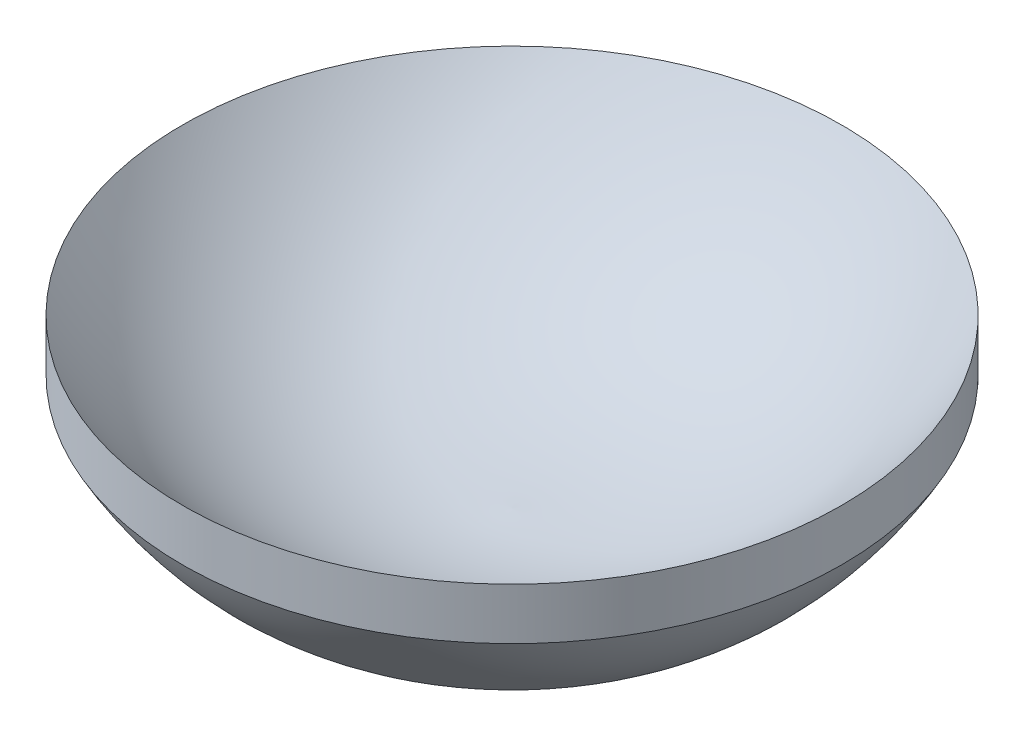
ISO-10303-21;
HEADER;
FILE_DESCRIPTION(('STEP AP214'),'2;1');
FILE_NAME('part.step','',(''),(''),'','','');
FILE_SCHEMA(('AUTOMOTIVE_DESIGN { 1 0 10303 214 1 1 1 1 }'));
ENDSEC;
DATA;
#1=APPLICATION_CONTEXT('core data for automotive mechanical design processes');
#2=APPLICATION_PROTOCOL_DEFINITION('international standard','automotive_design',2000,#1);
#3=PRODUCT_CONTEXT('',#1,'mechanical');
#4=PRODUCT('Part','Part','',(#3));
#5=PRODUCT_RELATED_PRODUCT_CATEGORY('part','',(#4));
#6=PRODUCT_DEFINITION_FORMATION('','',#4);
#7=PRODUCT_DEFINITION_CONTEXT('part definition',#1,'design');
#8=PRODUCT_DEFINITION('design','',#6,#7);
#9=PRODUCT_DEFINITION_SHAPE('','',#8);
#10=(LENGTH_UNIT() NAMED_UNIT(*) SI_UNIT(.MILLI.,.METRE.));
#11=(NAMED_UNIT(*) PLANE_ANGLE_UNIT() SI_UNIT($,.RADIAN.));
#12=(NAMED_UNIT(*) SI_UNIT($,.STERADIAN.) SOLID_ANGLE_UNIT());
#13=UNCERTAINTY_MEASURE_WITH_UNIT(LENGTH_MEASURE(1.E-05),#10,'distance_accuracy_value','');
#14=(GEOMETRIC_REPRESENTATION_CONTEXT(3) GLOBAL_UNCERTAINTY_ASSIGNED_CONTEXT((#13)) GLOBAL_UNIT_ASSIGNED_CONTEXT((#10,
#11,#12)) REPRESENTATION_CONTEXT('',''));
#15=CARTESIAN_POINT('',(0.,0.,0.));
#16=DIRECTION('',(0.,0.,1.));
#17=DIRECTION('',(1.,0.,0.));
#18=AXIS2_PLACEMENT_3D('',#15,#16,#17);
#19=CARTESIAN_POINT('',(0.,0.,0.));
#20=CARTESIAN_POINT('',(226.295545368617,-25.0935492037219,0.));
#21=CARTESIAN_POINT('',(325.12,152.4,0.));
#22=B_SPLINE_CURVE_WITH_KNOTS('',2,(#19,#20,#21),.UNSPECIFIED.,.F.,.F.,(3,3),(0.,1.),.UNSPECIFIED.);
#23=CARTESIAN_POINT('',(0.,0.,0.));
#24=DIRECTION('',(0.,-1.,0.));
#25=AXIS1_PLACEMENT('',#23,#24);
#26=SURFACE_OF_REVOLUTION('',#22,#25);
#27=CARTESIAN_POINT('',(0.,152.4,0.));
#28=DIRECTION('',(0.,-1.,0.));
#29=DIRECTION('',(1.,0.,0.));
#30=AXIS2_PLACEMENT_3D('',#27,#28,#29);
#31=CIRCLE('',#30,325.12);
#32=CARTESIAN_POINT('',(325.12,152.4,0.));
#33=VERTEX_POINT('',#32);
#34=EDGE_CURVE('E54',#33,#33,#31,.T.);
#35=ORIENTED_EDGE('',*,*,#34,.T.);
#36=EDGE_LOOP('',(#35));
#37=FACE_BOUND('',#36,.T.);
#38=CARTESIAN_POINT('',(0.,0.,0.));
#39=VERTEX_POINT('',#38);
#40=VERTEX_LOOP('',#39);
#41=FACE_BOUND('',#40,.T.);
#42=ADVANCED_FACE('F45',(#37,#41),#26,.F.);
#43=CARTESIAN_POINT('',(325.12,203.2,0.));
#44=CARTESIAN_POINT('',(207.140771479482,29.9469569631887,0.));
#45=CARTESIAN_POINT('',(0.,38.1,0.));
#46=B_SPLINE_CURVE_WITH_KNOTS('',2,(#43,#44,#45),.UNSPECIFIED.,.F.,.F.,(3,3),(0.,1.),.UNSPECIFIED.);
#47=CARTESIAN_POINT('',(0.,0.,0.));
#48=DIRECTION('',(0.,-1.,0.));
#49=AXIS1_PLACEMENT('',#47,#48);
#50=SURFACE_OF_REVOLUTION('',#46,#49);
#51=CARTESIAN_POINT('',(0.,38.1,0.));
#52=VERTEX_POINT('',#51);
#53=VERTEX_LOOP('',#52);
#54=FACE_BOUND('',#53,.T.);
#55=CARTESIAN_POINT('',(0.,203.2,0.));
#56=DIRECTION('',(0.,-1.,0.));
#57=DIRECTION('',(1.,0.,0.));
#58=AXIS2_PLACEMENT_3D('',#55,#56,#57);
#59=CIRCLE('',#58,325.12);
#60=CARTESIAN_POINT('',(325.12,203.2,0.));
#61=VERTEX_POINT('',#60);
#62=EDGE_CURVE('E11',#61,#61,#59,.T.);
#63=ORIENTED_EDGE('',*,*,#62,.F.);
#64=EDGE_LOOP('',(#63));
#65=FACE_BOUND('',#64,.T.);
#66=ADVANCED_FACE('F60',(#54,#65),#50,.F.);
#67=CARTESIAN_POINT('',(0.,0.,0.));
#68=DIRECTION('',(0.,-1.,0.));
#69=DIRECTION('',(1.,0.,0.));
#70=AXIS2_PLACEMENT_3D('',#67,#68,#69);
#71=CYLINDRICAL_SURFACE('',#70,325.12);
#72=ORIENTED_EDGE('',*,*,#62,.T.);
#73=EDGE_LOOP('',(#72));
#74=FACE_BOUND('',#73,.T.);
#75=ORIENTED_EDGE('',*,*,#34,.F.);
#76=EDGE_LOOP('',(#75));
#77=FACE_BOUND('',#76,.T.);
#78=ADVANCED_FACE('F63',(#74,#77),#71,.T.);
#79=CLOSED_SHELL('',(#42,#66,#78));
#80=MANIFOLD_SOLID_BREP('B2',#79);
#81=ADVANCED_BREP_SHAPE_REPRESENTATION('',(#18,#80),#14);
#82=SHAPE_DEFINITION_REPRESENTATION(#9,#81);
ENDSEC;
END-ISO-10303-21;
